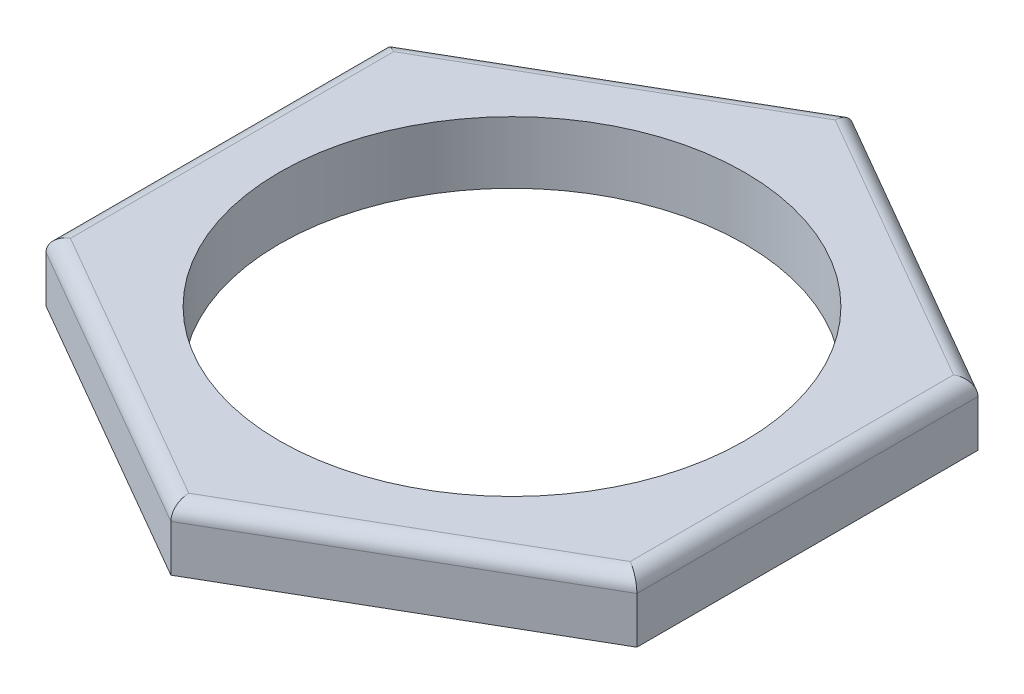
ISO-10303-21;
HEADER;
FILE_DESCRIPTION(('STEP AP214'),'2;1');
FILE_NAME('part.step','',(''),(''),'','','');
FILE_SCHEMA(('AUTOMOTIVE_DESIGN { 1 0 10303 214 1 1 1 1 }'));
ENDSEC;
DATA;
#1=APPLICATION_CONTEXT('core data for automotive mechanical design processes');
#2=APPLICATION_PROTOCOL_DEFINITION('international standard','automotive_design',2000,#1);
#3=PRODUCT_CONTEXT('',#1,'mechanical');
#4=PRODUCT('Part','Part','',(#3));
#5=PRODUCT_RELATED_PRODUCT_CATEGORY('part','',(#4));
#6=PRODUCT_DEFINITION_FORMATION('','',#4);
#7=PRODUCT_DEFINITION_CONTEXT('part definition',#1,'design');
#8=PRODUCT_DEFINITION('design','',#6,#7);
#9=PRODUCT_DEFINITION_SHAPE('','',#8);
#10=(LENGTH_UNIT() NAMED_UNIT(*) SI_UNIT(.MILLI.,.METRE.));
#11=(NAMED_UNIT(*) PLANE_ANGLE_UNIT() SI_UNIT($,.RADIAN.));
#12=(NAMED_UNIT(*) SI_UNIT($,.STERADIAN.) SOLID_ANGLE_UNIT());
#13=UNCERTAINTY_MEASURE_WITH_UNIT(LENGTH_MEASURE(1.E-05),#10,'distance_accuracy_value','');
#14=(GEOMETRIC_REPRESENTATION_CONTEXT(3) GLOBAL_UNCERTAINTY_ASSIGNED_CONTEXT((#13)) GLOBAL_UNIT_ASSIGNED_CONTEXT((#10,
#11,#12)) REPRESENTATION_CONTEXT('',''));
#15=CARTESIAN_POINT('',(0.,0.,0.));
#16=DIRECTION('',(0.,0.,1.));
#17=DIRECTION('',(1.,0.,0.));
#18=AXIS2_PLACEMENT_3D('',#15,#16,#17);
#19=CARTESIAN_POINT('',(0.,2.,0.));
#20=DIRECTION('',(0.,-1.,0.));
#21=DIRECTION('',(0.,0.,-1.));
#22=AXIS2_PLACEMENT_3D('',#19,#20,#21);
#23=PLANE('',#22);
#24=DIRECTION('',(-0.866025403784439,0.,0.5));
#25=VECTOR('',#24,1.);
#26=CARTESIAN_POINT('',(-4.51313972081441,2.,-7.81698729810778));
#27=LINE('',#26,#25);
#28=CARTESIAN_POINT('',(0.,2.,-10.4226497308104));
#29=VERTEX_POINT('',#28);
#30=CARTESIAN_POINT('',(-9.02627944162882,2.,-5.21132486540519));
#31=VERTEX_POINT('',#30);
#32=EDGE_CURVE('E160',#29,#31,#27,.T.);
#33=ORIENTED_EDGE('',*,*,#32,.T.);
#34=DIRECTION('',(0.,0.,1.));
#35=VECTOR('',#34,1.);
#36=CARTESIAN_POINT('',(-9.02627944162882,2.,0.));
#37=LINE('',#36,#35);
#38=CARTESIAN_POINT('',(-9.02627944162882,2.,5.21132486540519));
#39=VERTEX_POINT('',#38);
#40=EDGE_CURVE('E162',#31,#39,#37,.T.);
#41=ORIENTED_EDGE('',*,*,#40,.T.);
#42=DIRECTION('',(0.866025403784439,0.,0.5));
#43=VECTOR('',#42,1.);
#44=CARTESIAN_POINT('',(-4.51313972081441,2.,7.81698729810778));
#45=LINE('',#44,#43);
#46=CARTESIAN_POINT('',(0.,2.,10.4226497308104));
#47=VERTEX_POINT('',#46);
#48=EDGE_CURVE('E153',#39,#47,#45,.T.);
#49=ORIENTED_EDGE('',*,*,#48,.T.);
#50=DIRECTION('',(0.866025403784439,0.,-0.5));
#51=VECTOR('',#50,1.);
#52=CARTESIAN_POINT('',(4.51313972081441,2.,7.81698729810778));
#53=LINE('',#52,#51);
#54=CARTESIAN_POINT('',(9.02627944162882,2.,5.21132486540519));
#55=VERTEX_POINT('',#54);
#56=EDGE_CURVE('E111',#47,#55,#53,.T.);
#57=ORIENTED_EDGE('',*,*,#56,.T.);
#58=DIRECTION('',(0.,0.,-1.));
#59=VECTOR('',#58,1.);
#60=CARTESIAN_POINT('',(9.02627944162882,2.,0.));
#61=LINE('',#60,#59);
#62=CARTESIAN_POINT('',(9.02627944162882,2.,-5.21132486540519));
#63=VERTEX_POINT('',#62);
#64=EDGE_CURVE('E155',#55,#63,#61,.T.);
#65=ORIENTED_EDGE('',*,*,#64,.T.);
#66=DIRECTION('',(-0.866025403784439,0.,-0.5));
#67=VECTOR('',#66,1.);
#68=CARTESIAN_POINT('',(4.51313972081441,2.,-7.81698729810778));
#69=LINE('',#68,#67);
#70=EDGE_CURVE('E157',#63,#29,#69,.T.);
#71=ORIENTED_EDGE('',*,*,#70,.T.);
#72=EDGE_LOOP('',(#33,#41,#49,#57,#65,#71));
#73=FACE_BOUND('',#72,.T.);
#74=CARTESIAN_POINT('',(0.,2.,0.));
#75=DIRECTION('',(0.,1.,0.));
#76=DIRECTION('',(0.,0.,1.));
#77=AXIS2_PLACEMENT_3D('',#74,#75,#76);
#78=CIRCLE('',#77,7.5);
#79=CARTESIAN_POINT('',(0.,2.,7.5));
#80=VERTEX_POINT('',#79);
#81=EDGE_CURVE('E128',#80,#80,#78,.T.);
#82=ORIENTED_EDGE('',*,*,#81,.F.);
#83=EDGE_LOOP('',(#82));
#84=FACE_BOUND('',#83,.T.);
#85=ADVANCED_FACE('F32',(#73,#84),#23,.F.);
#86=CARTESIAN_POINT('',(0.,0.,0.));
#87=DIRECTION('',(0.,-1.,0.));
#88=DIRECTION('',(0.,0.,-1.));
#89=AXIS2_PLACEMENT_3D('',#86,#87,#88);
#90=PLANE('',#89);
#91=DIRECTION('',(-0.866025403784439,0.,0.5));
#92=VECTOR('',#91,1.);
#93=CARTESIAN_POINT('',(-9.52627944162883,0.,-5.5));
#94=LINE('',#93,#92);
#95=CARTESIAN_POINT('',(0.,0.,-11.));
#96=VERTEX_POINT('',#95);
#97=CARTESIAN_POINT('',(-9.52627944162883,0.,-5.5));
#98=VERTEX_POINT('',#97);
#99=EDGE_CURVE('E119',#96,#98,#94,.T.);
#100=ORIENTED_EDGE('',*,*,#99,.F.);
#101=DIRECTION('',(-0.866025403784439,0.,-0.5));
#102=VECTOR('',#101,1.);
#103=CARTESIAN_POINT('',(0.,0.,-11.));
#104=LINE('',#103,#102);
#105=CARTESIAN_POINT('',(9.52627944162883,0.,-5.5));
#106=VERTEX_POINT('',#105);
#107=EDGE_CURVE('E142',#106,#96,#104,.T.);
#108=ORIENTED_EDGE('',*,*,#107,.F.);
#109=DIRECTION('',(0.,0.,-1.));
#110=VECTOR('',#109,1.);
#111=CARTESIAN_POINT('',(9.52627944162883,0.,-5.5));
#112=LINE('',#111,#110);
#113=CARTESIAN_POINT('',(9.52627944162883,0.,5.5));
#114=VERTEX_POINT('',#113);
#115=EDGE_CURVE('E139',#114,#106,#112,.T.);
#116=ORIENTED_EDGE('',*,*,#115,.F.);
#117=DIRECTION('',(0.866025403784439,0.,-0.5));
#118=VECTOR('',#117,1.);
#119=CARTESIAN_POINT('',(9.52627944162883,0.,5.5));
#120=LINE('',#119,#118);
#121=CARTESIAN_POINT('',(0.,0.,11.));
#122=VERTEX_POINT('',#121);
#123=EDGE_CURVE('E136',#122,#114,#120,.T.);
#124=ORIENTED_EDGE('',*,*,#123,.F.);
#125=DIRECTION('',(0.866025403784439,0.,0.5));
#126=VECTOR('',#125,1.);
#127=CARTESIAN_POINT('',(0.,0.,11.));
#128=LINE('',#127,#126);
#129=CARTESIAN_POINT('',(-9.52627944162883,0.,5.5));
#130=VERTEX_POINT('',#129);
#131=EDGE_CURVE('E122',#130,#122,#128,.T.);
#132=ORIENTED_EDGE('',*,*,#131,.F.);
#133=DIRECTION('',(0.,0.,1.));
#134=VECTOR('',#133,1.);
#135=CARTESIAN_POINT('',(-9.52627944162883,0.,5.5));
#136=LINE('',#135,#134);
#137=EDGE_CURVE('E106',#98,#130,#136,.T.);
#138=ORIENTED_EDGE('',*,*,#137,.F.);
#139=EDGE_LOOP('',(#100,#108,#116,#124,#132,#138));
#140=FACE_BOUND('',#139,.T.);
#141=CARTESIAN_POINT('',(0.,0.,0.));
#142=DIRECTION('',(0.,1.,0.));
#143=DIRECTION('',(0.,0.,1.));
#144=AXIS2_PLACEMENT_3D('',#141,#142,#143);
#145=CIRCLE('',#144,7.5);
#146=CARTESIAN_POINT('',(0.,0.,7.5));
#147=VERTEX_POINT('',#146);
#148=EDGE_CURVE('E131',#147,#147,#145,.T.);
#149=ORIENTED_EDGE('',*,*,#148,.T.);
#150=EDGE_LOOP('',(#149));
#151=FACE_BOUND('',#150,.T.);
#152=ADVANCED_FACE('F116',(#140,#151),#90,.T.);
#153=CARTESIAN_POINT('',(-9.52627944162883,2.,-5.5));
#154=DIRECTION('',(0.5,0.,0.866025403784439));
#155=DIRECTION('',(0.866025403784439,0.,-0.5));
#156=AXIS2_PLACEMENT_3D('',#153,#154,#155);
#157=PLANE('',#156);
#158=DIRECTION('',(0.,-1.,0.));
#159=VECTOR('',#158,1.);
#160=CARTESIAN_POINT('',(-9.52627944162883,2.,-5.5));
#161=LINE('',#160,#159);
#162=CARTESIAN_POINT('',(-9.52627944162883,1.5,-5.5));
#163=VERTEX_POINT('',#162);
#164=EDGE_CURVE('E103',#163,#98,#161,.T.);
#165=ORIENTED_EDGE('',*,*,#164,.F.);
#166=DIRECTION('',(-0.866025403784439,0.,0.5));
#167=VECTOR('',#166,1.);
#168=CARTESIAN_POINT('',(-9.52627944162883,1.5,-5.5));
#169=LINE('',#168,#167);
#170=CARTESIAN_POINT('',(0.,1.5,-11.));
#171=VERTEX_POINT('',#170);
#172=EDGE_CURVE('E41',#163,#171,#169,.F.);
#173=ORIENTED_EDGE('',*,*,#172,.T.);
#174=DIRECTION('',(0.,-1.,0.));
#175=VECTOR('',#174,1.);
#176=CARTESIAN_POINT('',(0.,2.,-11.));
#177=LINE('',#176,#175);
#178=EDGE_CURVE('E126',#171,#96,#177,.T.);
#179=ORIENTED_EDGE('',*,*,#178,.T.);
#180=ORIENTED_EDGE('',*,*,#99,.T.);
#181=EDGE_LOOP('',(#165,#173,#179,#180));
#182=FACE_BOUND('',#181,.T.);
#183=ADVANCED_FACE('F124',(#182),#157,.F.);
#184=CARTESIAN_POINT('',(-9.52627944162883,2.,5.5));
#185=DIRECTION('',(1.,0.,0.));
#186=DIRECTION('',(0.,0.,-1.));
#187=AXIS2_PLACEMENT_3D('',#184,#185,#186);
#188=PLANE('',#187);
#189=DIRECTION('',(0.,-1.,0.));
#190=VECTOR('',#189,1.);
#191=CARTESIAN_POINT('',(-9.52627944162883,2.,5.5));
#192=LINE('',#191,#190);
#193=CARTESIAN_POINT('',(-9.52627944162883,1.5,5.5));
#194=VERTEX_POINT('',#193);
#195=EDGE_CURVE('E112',#194,#130,#192,.T.);
#196=ORIENTED_EDGE('',*,*,#195,.F.);
#197=DIRECTION('',(0.,0.,1.));
#198=VECTOR('',#197,1.);
#199=CARTESIAN_POINT('',(-9.52627944162883,1.5,5.5));
#200=LINE('',#199,#198);
#201=EDGE_CURVE('E49',#194,#163,#200,.F.);
#202=ORIENTED_EDGE('',*,*,#201,.T.);
#203=ORIENTED_EDGE('',*,*,#164,.T.);
#204=ORIENTED_EDGE('',*,*,#137,.T.);
#205=EDGE_LOOP('',(#196,#202,#203,#204));
#206=FACE_BOUND('',#205,.T.);
#207=ADVANCED_FACE('F105',(#206),#188,.F.);
#208=CARTESIAN_POINT('',(0.,2.,11.));
#209=DIRECTION('',(0.5,0.,-0.866025403784439));
#210=DIRECTION('',(-0.866025403784439,0.,-0.5));
#211=AXIS2_PLACEMENT_3D('',#208,#209,#210);
#212=PLANE('',#211);
#213=DIRECTION('',(0.,-1.,0.));
#214=VECTOR('',#213,1.);
#215=CARTESIAN_POINT('',(0.,2.,11.));
#216=LINE('',#215,#214);
#217=CARTESIAN_POINT('',(0.,1.5,11.));
#218=VERTEX_POINT('',#217);
#219=EDGE_CURVE('E149',#218,#122,#216,.T.);
#220=ORIENTED_EDGE('',*,*,#219,.F.);
#221=DIRECTION('',(0.866025403784439,0.,0.5));
#222=VECTOR('',#221,1.);
#223=CARTESIAN_POINT('',(0.,1.5,11.));
#224=LINE('',#223,#222);
#225=EDGE_CURVE('E57',#218,#194,#224,.F.);
#226=ORIENTED_EDGE('',*,*,#225,.T.);
#227=ORIENTED_EDGE('',*,*,#195,.T.);
#228=ORIENTED_EDGE('',*,*,#131,.T.);
#229=EDGE_LOOP('',(#220,#226,#227,#228));
#230=FACE_BOUND('',#229,.T.);
#231=ADVANCED_FACE('F223',(#230),#212,.F.);
#232=CARTESIAN_POINT('',(9.52627944162883,2.,5.5));
#233=DIRECTION('',(-0.5,0.,-0.866025403784439));
#234=DIRECTION('',(-0.866025403784439,0.,0.5));
#235=AXIS2_PLACEMENT_3D('',#232,#233,#234);
#236=PLANE('',#235);
#237=DIRECTION('',(0.,-1.,0.));
#238=VECTOR('',#237,1.);
#239=CARTESIAN_POINT('',(9.52627944162883,2.,5.5));
#240=LINE('',#239,#238);
#241=CARTESIAN_POINT('',(9.52627944162883,1.5,5.5));
#242=VERTEX_POINT('',#241);
#243=EDGE_CURVE('E147',#242,#114,#240,.T.);
#244=ORIENTED_EDGE('',*,*,#243,.F.);
#245=DIRECTION('',(0.866025403784439,0.,-0.5));
#246=VECTOR('',#245,1.);
#247=CARTESIAN_POINT('',(9.52627944162883,1.5,5.5));
#248=LINE('',#247,#246);
#249=EDGE_CURVE('E11',#242,#218,#248,.F.);
#250=ORIENTED_EDGE('',*,*,#249,.T.);
#251=ORIENTED_EDGE('',*,*,#219,.T.);
#252=ORIENTED_EDGE('',*,*,#123,.T.);
#253=EDGE_LOOP('',(#244,#250,#251,#252));
#254=FACE_BOUND('',#253,.T.);
#255=ADVANCED_FACE('F219',(#254),#236,.F.);
#256=CARTESIAN_POINT('',(9.52627944162883,2.,-5.5));
#257=DIRECTION('',(-1.,0.,0.));
#258=DIRECTION('',(0.,0.,1.));
#259=AXIS2_PLACEMENT_3D('',#256,#257,#258);
#260=PLANE('',#259);
#261=DIRECTION('',(0.,-1.,0.));
#262=VECTOR('',#261,1.);
#263=CARTESIAN_POINT('',(9.52627944162883,2.,-5.5));
#264=LINE('',#263,#262);
#265=CARTESIAN_POINT('',(9.52627944162883,1.5,-5.5));
#266=VERTEX_POINT('',#265);
#267=EDGE_CURVE('E145',#266,#106,#264,.T.);
#268=ORIENTED_EDGE('',*,*,#267,.F.);
#269=DIRECTION('',(0.,0.,-1.));
#270=VECTOR('',#269,1.);
#271=CARTESIAN_POINT('',(9.52627944162883,1.5,-5.5));
#272=LINE('',#271,#270);
#273=EDGE_CURVE('E167',#266,#242,#272,.F.);
#274=ORIENTED_EDGE('',*,*,#273,.T.);
#275=ORIENTED_EDGE('',*,*,#243,.T.);
#276=ORIENTED_EDGE('',*,*,#115,.T.);
#277=EDGE_LOOP('',(#268,#274,#275,#276));
#278=FACE_BOUND('',#277,.T.);
#279=ADVANCED_FACE('F205',(#278),#260,.F.);
#280=CARTESIAN_POINT('',(0.,2.,-11.));
#281=DIRECTION('',(-0.5,0.,0.866025403784439));
#282=DIRECTION('',(0.866025403784439,0.,0.5));
#283=AXIS2_PLACEMENT_3D('',#280,#281,#282);
#284=PLANE('',#283);
#285=ORIENTED_EDGE('',*,*,#178,.F.);
#286=DIRECTION('',(-0.866025403784439,0.,-0.5));
#287=VECTOR('',#286,1.);
#288=CARTESIAN_POINT('',(0.,1.5,-11.));
#289=LINE('',#288,#287);
#290=EDGE_CURVE('E164',#171,#266,#289,.F.);
#291=ORIENTED_EDGE('',*,*,#290,.T.);
#292=ORIENTED_EDGE('',*,*,#267,.T.);
#293=ORIENTED_EDGE('',*,*,#107,.T.);
#294=EDGE_LOOP('',(#285,#291,#292,#293));
#295=FACE_BOUND('',#294,.T.);
#296=ADVANCED_FACE('F196',(#295),#284,.F.);
#297=CARTESIAN_POINT('',(0.,2.,0.));
#298=DIRECTION('',(0.,-1.,0.));
#299=DIRECTION('',(0.,0.,-1.));
#300=AXIS2_PLACEMENT_3D('',#297,#298,#299);
#301=CYLINDRICAL_SURFACE('',#300,7.5);
#302=ORIENTED_EDGE('',*,*,#81,.T.);
#303=EDGE_LOOP('',(#302));
#304=FACE_BOUND('',#303,.T.);
#305=ORIENTED_EDGE('',*,*,#148,.F.);
#306=EDGE_LOOP('',(#305));
#307=FACE_BOUND('',#306,.T.);
#308=ADVANCED_FACE('F194',(#304,#307),#301,.F.);
#309=CARTESIAN_POINT('',(-4.51313972081441,1.5,7.81698729810778));
#310=DIRECTION('',(0.866025403784439,0.,0.5));
#311=DIRECTION('',(0.5,0.,-0.866025403784439));
#312=AXIS2_PLACEMENT_3D('',#309,#310,#311);
#313=CYLINDRICAL_SURFACE('',#312,0.5);
#314=CARTESIAN_POINT('',(-9.02627944162882,1.5,5.21132486540519));
#315=DIRECTION('',(0.5,0.,0.866025403784439));
#316=DIRECTION('',(-0.866025403784439,0.,0.5));
#317=AXIS2_PLACEMENT_3D('',#314,#315,#316);
#318=ELLIPSE('',#317,0.577350269189626,0.5);
#319=EDGE_CURVE('E181',#194,#39,#318,.F.);
#320=ORIENTED_EDGE('',*,*,#319,.F.);
#321=ORIENTED_EDGE('',*,*,#225,.F.);
#322=CARTESIAN_POINT('',(0.,1.5,10.4226497308104));
#323=DIRECTION('',(1.,0.,0.));
#324=DIRECTION('',(0.,0.,-1.));
#325=AXIS2_PLACEMENT_3D('',#322,#323,#324);
#326=ELLIPSE('',#325,0.577350269189626,0.5);
#327=EDGE_CURVE('E36',#47,#218,#326,.T.);
#328=ORIENTED_EDGE('',*,*,#327,.F.);
#329=ORIENTED_EDGE('',*,*,#48,.F.);
#330=EDGE_LOOP('',(#320,#321,#328,#329));
#331=FACE_BOUND('',#330,.T.);
#332=ADVANCED_FACE('F34',(#331),#313,.T.);
#333=CARTESIAN_POINT('',(4.51313972081441,1.5,7.81698729810778));
#334=DIRECTION('',(0.866025403784439,0.,-0.5));
#335=DIRECTION('',(-0.5,0.,-0.866025403784439));
#336=AXIS2_PLACEMENT_3D('',#333,#334,#335);
#337=CYLINDRICAL_SURFACE('',#336,0.5);
#338=ORIENTED_EDGE('',*,*,#327,.T.);
#339=ORIENTED_EDGE('',*,*,#249,.F.);
#340=CARTESIAN_POINT('',(9.02627944162882,1.5,5.21132486540519));
#341=DIRECTION('',(0.5,0.,-0.866025403784439));
#342=DIRECTION('',(0.866025403784439,0.,0.5));
#343=AXIS2_PLACEMENT_3D('',#340,#341,#342);
#344=ELLIPSE('',#343,0.577350269189626,0.5);
#345=EDGE_CURVE('E179',#55,#242,#344,.T.);
#346=ORIENTED_EDGE('',*,*,#345,.F.);
#347=ORIENTED_EDGE('',*,*,#56,.F.);
#348=EDGE_LOOP('',(#338,#339,#346,#347));
#349=FACE_BOUND('',#348,.T.);
#350=ADVANCED_FACE('F203',(#349),#337,.T.);
#351=CARTESIAN_POINT('',(-9.02627944162882,1.5,0.));
#352=DIRECTION('',(0.,0.,1.));
#353=DIRECTION('',(1.,0.,0.));
#354=AXIS2_PLACEMENT_3D('',#351,#352,#353);
#355=CYLINDRICAL_SURFACE('',#354,0.5);
#356=ORIENTED_EDGE('',*,*,#319,.T.);
#357=ORIENTED_EDGE('',*,*,#40,.F.);
#358=CARTESIAN_POINT('',(-9.02627944162882,1.5,-5.21132486540519));
#359=DIRECTION('',(-0.5,0.,0.866025403784439));
#360=DIRECTION('',(-0.866025403784439,0.,-0.5));
#361=AXIS2_PLACEMENT_3D('',#358,#359,#360);
#362=ELLIPSE('',#361,0.577350269189626,0.5);
#363=EDGE_CURVE('E176',#163,#31,#362,.F.);
#364=ORIENTED_EDGE('',*,*,#363,.F.);
#365=ORIENTED_EDGE('',*,*,#201,.F.);
#366=EDGE_LOOP('',(#356,#357,#364,#365));
#367=FACE_BOUND('',#366,.T.);
#368=ADVANCED_FACE('F242',(#367),#355,.T.);
#369=CARTESIAN_POINT('',(9.02627944162882,1.5,0.));
#370=DIRECTION('',(0.,0.,-1.));
#371=DIRECTION('',(-1.,0.,0.));
#372=AXIS2_PLACEMENT_3D('',#369,#370,#371);
#373=CYLINDRICAL_SURFACE('',#372,0.5);
#374=ORIENTED_EDGE('',*,*,#345,.T.);
#375=ORIENTED_EDGE('',*,*,#273,.F.);
#376=CARTESIAN_POINT('',(9.02627944162883,1.5,-5.21132486540519));
#377=DIRECTION('',(-0.5,0.,-0.866025403784439));
#378=DIRECTION('',(0.866025403784439,0.,-0.5));
#379=AXIS2_PLACEMENT_3D('',#376,#377,#378);
#380=ELLIPSE('',#379,0.577350269189626,0.5);
#381=EDGE_CURVE('E174',#63,#266,#380,.T.);
#382=ORIENTED_EDGE('',*,*,#381,.F.);
#383=ORIENTED_EDGE('',*,*,#64,.F.);
#384=EDGE_LOOP('',(#374,#375,#382,#383));
#385=FACE_BOUND('',#384,.T.);
#386=ADVANCED_FACE('F238',(#385),#373,.T.);
#387=CARTESIAN_POINT('',(-4.51313972081441,1.5,-7.81698729810778));
#388=DIRECTION('',(-0.866025403784439,0.,0.5));
#389=DIRECTION('',(0.5,0.,0.866025403784439));
#390=AXIS2_PLACEMENT_3D('',#387,#388,#389);
#391=CYLINDRICAL_SURFACE('',#390,0.5);
#392=ORIENTED_EDGE('',*,*,#363,.T.);
#393=ORIENTED_EDGE('',*,*,#32,.F.);
#394=CARTESIAN_POINT('',(0.,1.5,-10.4226497308104));
#395=DIRECTION('',(-1.,0.,0.));
#396=DIRECTION('',(0.,0.,1.));
#397=AXIS2_PLACEMENT_3D('',#394,#395,#396);
#398=ELLIPSE('',#397,0.577350269189626,0.5);
#399=EDGE_CURVE('E172',#171,#29,#398,.F.);
#400=ORIENTED_EDGE('',*,*,#399,.F.);
#401=ORIENTED_EDGE('',*,*,#172,.F.);
#402=EDGE_LOOP('',(#392,#393,#400,#401));
#403=FACE_BOUND('',#402,.T.);
#404=ADVANCED_FACE('F234',(#403),#391,.T.);
#405=CARTESIAN_POINT('',(4.51313972081441,1.5,-7.81698729810778));
#406=DIRECTION('',(-0.866025403784439,0.,-0.5));
#407=DIRECTION('',(-0.5,0.,0.866025403784439));
#408=AXIS2_PLACEMENT_3D('',#405,#406,#407);
#409=CYLINDRICAL_SURFACE('',#408,0.5);
#410=ORIENTED_EDGE('',*,*,#381,.T.);
#411=ORIENTED_EDGE('',*,*,#290,.F.);
#412=ORIENTED_EDGE('',*,*,#399,.T.);
#413=ORIENTED_EDGE('',*,*,#70,.F.);
#414=EDGE_LOOP('',(#410,#411,#412,#413));
#415=FACE_BOUND('',#414,.T.);
#416=ADVANCED_FACE('F231',(#415),#409,.T.);
#417=CLOSED_SHELL('',(#85,#152,#183,#207,#231,#255,#279,#296,#308,#332,#350,#368,#386,#404,#416));
#418=MANIFOLD_SOLID_BREP('B2',#417);
#419=ADVANCED_BREP_SHAPE_REPRESENTATION('',(#18,#418),#14);
#420=SHAPE_DEFINITION_REPRESENTATION(#9,#419);
ENDSEC;
END-ISO-10303-21;
